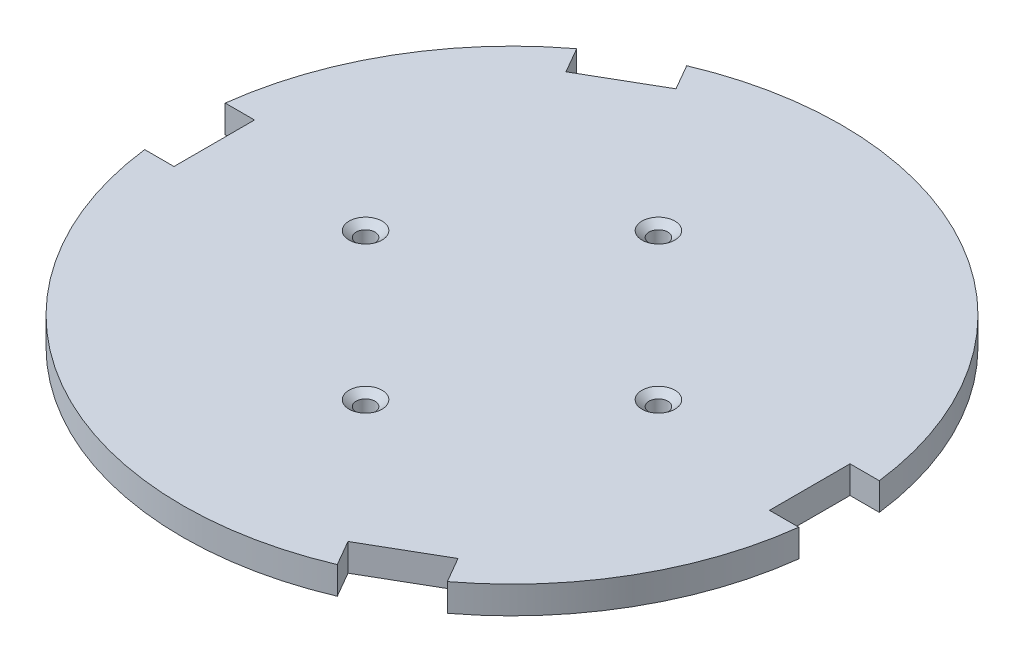
ISO-10303-21;
HEADER;
FILE_DESCRIPTION(('STEP AP214'),'2;1');
FILE_NAME('part.step','',(''),(''),'','','');
FILE_SCHEMA(('AUTOMOTIVE_DESIGN { 1 0 10303 214 1 1 1 1 }'));
ENDSEC;
DATA;
#1=APPLICATION_CONTEXT('core data for automotive mechanical design processes');
#2=APPLICATION_PROTOCOL_DEFINITION('international standard','automotive_design',2000,#1);
#3=PRODUCT_CONTEXT('',#1,'mechanical');
#4=PRODUCT('Part','Part','',(#3));
#5=PRODUCT_RELATED_PRODUCT_CATEGORY('part','',(#4));
#6=PRODUCT_DEFINITION_FORMATION('','',#4);
#7=PRODUCT_DEFINITION_CONTEXT('part definition',#1,'design');
#8=PRODUCT_DEFINITION('design','',#6,#7);
#9=PRODUCT_DEFINITION_SHAPE('','',#8);
#10=(LENGTH_UNIT() NAMED_UNIT(*) SI_UNIT(.MILLI.,.METRE.));
#11=(NAMED_UNIT(*) PLANE_ANGLE_UNIT() SI_UNIT($,.RADIAN.));
#12=(NAMED_UNIT(*) SI_UNIT($,.STERADIAN.) SOLID_ANGLE_UNIT());
#13=UNCERTAINTY_MEASURE_WITH_UNIT(LENGTH_MEASURE(1.E-05),#10,'distance_accuracy_value','');
#14=(GEOMETRIC_REPRESENTATION_CONTEXT(3) GLOBAL_UNCERTAINTY_ASSIGNED_CONTEXT((#13)) GLOBAL_UNIT_ASSIGNED_CONTEXT((#10,
#11,#12)) REPRESENTATION_CONTEXT('',''));
#15=CARTESIAN_POINT('',(0.,0.,0.));
#16=DIRECTION('',(0.,0.,1.));
#17=DIRECTION('',(1.,0.,0.));
#18=AXIS2_PLACEMENT_3D('',#15,#16,#17);
#19=CARTESIAN_POINT('',(0.,4.7625,0.));
#20=DIRECTION('',(0.,-1.,0.));
#21=DIRECTION('',(0.,0.,-1.));
#22=AXIS2_PLACEMENT_3D('',#19,#20,#21);
#23=CYLINDRICAL_SURFACE('',#22,57.15);
#24=CARTESIAN_POINT('',(0.,0.,0.));
#25=DIRECTION('',(0.,1.,0.));
#26=DIRECTION('',(0.,0.,1.));
#27=AXIS2_PLACEMENT_3D('',#24,#25,#26);
#28=CIRCLE('',#27,57.15);
#29=CARTESIAN_POINT('',(56.7215327278804,0.,-6.985));
#30=VERTEX_POINT('',#29);
#31=CARTESIAN_POINT('',(-22.3115789185058,0.,-52.6147882839349));
#32=VERTEX_POINT('',#31);
#33=EDGE_CURVE('E181',#30,#32,#28,.T.);
#34=ORIENTED_EDGE('',*,*,#33,.T.);
#35=DIRECTION('',(0.,1.,0.));
#36=VECTOR('',#35,1.);
#37=CARTESIAN_POINT('',(-22.3115789185058,-0.00100000000000013,-52.6147882839349));
#38=LINE('',#37,#36);
#39=CARTESIAN_POINT('',(-22.3115789185058,4.7625,-52.6147882839349));
#40=VERTEX_POINT('',#39);
#41=EDGE_CURVE('E293',#32,#40,#38,.T.);
#42=ORIENTED_EDGE('',*,*,#41,.T.);
#43=CARTESIAN_POINT('',(0.,4.7625,0.));
#44=DIRECTION('',(0.,1.,0.));
#45=DIRECTION('',(0.,0.,1.));
#46=AXIS2_PLACEMENT_3D('',#43,#44,#45);
#47=CIRCLE('',#46,57.15);
#48=CARTESIAN_POINT('',(56.7215327278804,4.7625,-6.985));
#49=VERTEX_POINT('',#48);
#50=EDGE_CURVE('E11',#49,#40,#47,.T.);
#51=ORIENTED_EDGE('',*,*,#50,.F.);
#52=DIRECTION('',(0.,1.,0.));
#53=VECTOR('',#52,1.);
#54=CARTESIAN_POINT('',(56.7215327278804,-0.00100000000000013,-6.985));
#55=LINE('',#54,#53);
#56=EDGE_CURVE('E260',#30,#49,#55,.T.);
#57=ORIENTED_EDGE('',*,*,#56,.F.);
#58=EDGE_LOOP('',(#34,#42,#51,#57));
#59=FACE_BOUND('',#58,.T.);
#60=ADVANCED_FACE('F38',(#59),#23,.T.);
#61=CARTESIAN_POINT('',(-56.7215327278803,0.,6.98500000000001));
#62=VERTEX_POINT('',#61);
#63=CARTESIAN_POINT('',(22.3115789185057,0.,52.6147882839349));
#64=VERTEX_POINT('',#63);
#65=EDGE_CURVE('E42',#62,#64,#28,.T.);
#66=ORIENTED_EDGE('',*,*,#65,.T.);
#67=DIRECTION('',(0.,1.,0.));
#68=VECTOR('',#67,1.);
#69=CARTESIAN_POINT('',(22.3115789185057,-0.00100000000000013,52.6147882839349));
#70=LINE('',#69,#68);
#71=CARTESIAN_POINT('',(22.3115789185057,4.7625,52.6147882839349));
#72=VERTEX_POINT('',#71);
#73=EDGE_CURVE('E154',#64,#72,#70,.T.);
#74=ORIENTED_EDGE('',*,*,#73,.T.);
#75=CARTESIAN_POINT('',(-56.7215327278804,4.7625,6.98500000000001));
#76=VERTEX_POINT('',#75);
#77=EDGE_CURVE('E49',#76,#72,#47,.T.);
#78=ORIENTED_EDGE('',*,*,#77,.F.);
#79=DIRECTION('',(0.,1.,0.));
#80=VECTOR('',#79,1.);
#81=CARTESIAN_POINT('',(-56.7215327278804,-0.00100000000000013,6.98500000000001));
#82=LINE('',#81,#80);
#83=EDGE_CURVE('E177',#62,#76,#82,.T.);
#84=ORIENTED_EDGE('',*,*,#83,.F.);
#85=EDGE_LOOP('',(#66,#74,#78,#84));
#86=FACE_BOUND('',#85,.T.);
#87=ADVANCED_FACE('F176',(#86),#23,.T.);
#88=CARTESIAN_POINT('',(-34.4099538093744,4.7625,-45.6297882839349));
#89=VERTEX_POINT('',#88);
#90=CARTESIAN_POINT('',(-56.7215327278804,4.7625,-6.98499999999999));
#91=VERTEX_POINT('',#90);
#92=EDGE_CURVE('E48',#89,#91,#47,.T.);
#93=ORIENTED_EDGE('',*,*,#92,.F.);
#94=DIRECTION('',(0.,1.,0.));
#95=VECTOR('',#94,1.);
#96=CARTESIAN_POINT('',(-34.4099538093744,-0.00100000000000013,-45.6297882839349));
#97=LINE('',#96,#95);
#98=CARTESIAN_POINT('',(-34.4099538093744,0.,-45.6297882839349));
#99=VERTEX_POINT('',#98);
#100=EDGE_CURVE('E294',#99,#89,#97,.T.);
#101=ORIENTED_EDGE('',*,*,#100,.F.);
#102=CARTESIAN_POINT('',(-56.7215327278804,0.,-6.98499999999999));
#103=VERTEX_POINT('',#102);
#104=EDGE_CURVE('E179',#99,#103,#28,.T.);
#105=ORIENTED_EDGE('',*,*,#104,.T.);
#106=DIRECTION('',(0.,1.,0.));
#107=VECTOR('',#106,1.);
#108=CARTESIAN_POINT('',(-56.7215327278804,-0.00100000000000013,-6.98499999999999));
#109=LINE('',#108,#107);
#110=EDGE_CURVE('E218',#103,#91,#109,.T.);
#111=ORIENTED_EDGE('',*,*,#110,.T.);
#112=EDGE_LOOP('',(#93,#101,#105,#111));
#113=FACE_BOUND('',#112,.T.);
#114=ADVANCED_FACE('F225',(#113),#23,.T.);
#115=CARTESIAN_POINT('',(34.4099538093744,4.7625,45.6297882839349));
#116=VERTEX_POINT('',#115);
#117=CARTESIAN_POINT('',(56.7215327278804,4.7625,6.985));
#118=VERTEX_POINT('',#117);
#119=EDGE_CURVE('E187',#116,#118,#47,.T.);
#120=ORIENTED_EDGE('',*,*,#119,.F.);
#121=DIRECTION('',(0.,1.,0.));
#122=VECTOR('',#121,1.);
#123=CARTESIAN_POINT('',(34.4099538093744,-0.00100000000000013,45.6297882839349));
#124=LINE('',#123,#122);
#125=CARTESIAN_POINT('',(34.4099538093744,0.,45.6297882839349));
#126=VERTEX_POINT('',#125);
#127=EDGE_CURVE('E165',#126,#116,#124,.T.);
#128=ORIENTED_EDGE('',*,*,#127,.F.);
#129=CARTESIAN_POINT('',(56.7215327278804,0.,6.985));
#130=VERTEX_POINT('',#129);
#131=EDGE_CURVE('E180',#126,#130,#28,.T.);
#132=ORIENTED_EDGE('',*,*,#131,.T.);
#133=DIRECTION('',(0.,1.,0.));
#134=VECTOR('',#133,1.);
#135=CARTESIAN_POINT('',(56.7215327278804,-0.00100000000000013,6.985));
#136=LINE('',#135,#134);
#137=EDGE_CURVE('E268',#130,#118,#136,.T.);
#138=ORIENTED_EDGE('',*,*,#137,.T.);
#139=EDGE_LOOP('',(#120,#128,#132,#138));
#140=FACE_BOUND('',#139,.T.);
#141=ADVANCED_FACE('F40',(#140),#23,.T.);
#142=CARTESIAN_POINT('',(0.,4.7625,0.));
#143=DIRECTION('',(0.,1.,0.));
#144=DIRECTION('',(0.,0.,1.));
#145=AXIS2_PLACEMENT_3D('',#142,#143,#144);
#146=PLANE('',#145);
#147=CARTESIAN_POINT('',(25.4,4.7625,0.));
#148=DIRECTION('',(0.,1.,0.));
#149=DIRECTION('',(0.,0.,1.));
#150=AXIS2_PLACEMENT_3D('',#147,#148,#149);
#151=CIRCLE('',#150,2.8575);
#152=CARTESIAN_POINT('',(25.4,4.7625,2.85749999999991));
#153=VERTEX_POINT('',#152);
#154=EDGE_CURVE('E384',#153,#153,#151,.T.);
#155=ORIENTED_EDGE('',*,*,#154,.F.);
#156=EDGE_LOOP('',(#155));
#157=FACE_BOUND('',#156,.T.);
#158=CARTESIAN_POINT('',(1.00613961606655E-13,4.7625,25.4));
#159=DIRECTION('',(0.,1.,0.));
#160=DIRECTION('',(0.,0.,1.));
#161=AXIS2_PLACEMENT_3D('',#158,#159,#160);
#162=CIRCLE('',#161,2.8575);
#163=CARTESIAN_POINT('',(1.00613961606655E-13,4.7625,28.2575));
#164=VERTEX_POINT('',#163);
#165=EDGE_CURVE('E372',#164,#164,#162,.T.);
#166=ORIENTED_EDGE('',*,*,#165,.F.);
#167=EDGE_LOOP('',(#166));
#168=FACE_BOUND('',#167,.T.);
#169=CARTESIAN_POINT('',(-1.00613961606655E-13,4.7625,-25.4));
#170=DIRECTION('',(0.,1.,0.));
#171=DIRECTION('',(0.,0.,1.));
#172=AXIS2_PLACEMENT_3D('',#169,#170,#171);
#173=CIRCLE('',#172,2.8575);
#174=CARTESIAN_POINT('',(-1.00613961606655E-13,4.7625,-22.5425));
#175=VERTEX_POINT('',#174);
#176=EDGE_CURVE('E360',#175,#175,#173,.T.);
#177=ORIENTED_EDGE('',*,*,#176,.F.);
#178=EDGE_LOOP('',(#177));
#179=FACE_BOUND('',#178,.T.);
#180=CARTESIAN_POINT('',(-25.4,4.7625,1.00613961606655E-13));
#181=DIRECTION('',(0.,1.,0.));
#182=DIRECTION('',(0.,0.,1.));
#183=AXIS2_PLACEMENT_3D('',#180,#181,#182);
#184=CIRCLE('',#183,2.8575);
#185=CARTESIAN_POINT('',(-25.4,4.7625,2.8575000000001));
#186=VERTEX_POINT('',#185);
#187=EDGE_CURVE('E348',#186,#186,#184,.T.);
#188=ORIENTED_EDGE('',*,*,#187,.F.);
#189=EDGE_LOOP('',(#188));
#190=FACE_BOUND('',#189,.T.);
#191=DIRECTION('',(0.499999999999998,0.,0.86602540378444));
#192=VECTOR('',#191,1.);
#193=CARTESIAN_POINT('',(19.7715789185057,4.7625,48.2153792327099));
#194=LINE('',#193,#192);
#195=CARTESIAN_POINT('',(19.7715789185057,4.7625,48.2153792327099));
#196=VERTEX_POINT('',#195);
#197=EDGE_CURVE('E159',#196,#72,#194,.T.);
#198=ORIENTED_EDGE('',*,*,#197,.F.);
#199=DIRECTION('',(-0.866025403784441,0.,0.499999999999996));
#200=VECTOR('',#199,1.);
#201=CARTESIAN_POINT('',(19.7715789185057,4.7625,48.2153792327099));
#202=LINE('',#201,#200);
#203=CARTESIAN_POINT('',(31.8699538093744,4.7625,41.2303792327099));
#204=VERTEX_POINT('',#203);
#205=EDGE_CURVE('E166',#204,#196,#202,.T.);
#206=ORIENTED_EDGE('',*,*,#205,.F.);
#207=DIRECTION('',(-0.499999999999997,0.,-0.86602540378444));
#208=VECTOR('',#207,1.);
#209=CARTESIAN_POINT('',(31.8699538093744,4.7625,41.2303792327099));
#210=LINE('',#209,#208);
#211=EDGE_CURVE('E331',#116,#204,#210,.T.);
#212=ORIENTED_EDGE('',*,*,#211,.F.);
#213=ORIENTED_EDGE('',*,*,#119,.T.);
#214=DIRECTION('',(1.,0.,0.));
#215=VECTOR('',#214,1.);
#216=CARTESIAN_POINT('',(51.6415327278804,4.7625,6.985));
#217=LINE('',#216,#215);
#218=CARTESIAN_POINT('',(51.6415327278804,4.7625,6.985));
#219=VERTEX_POINT('',#218);
#220=EDGE_CURVE('E265',#219,#118,#217,.T.);
#221=ORIENTED_EDGE('',*,*,#220,.F.);
#222=DIRECTION('',(0.,0.,1.));
#223=VECTOR('',#222,1.);
#224=CARTESIAN_POINT('',(51.6415327278804,4.7625,-6.985));
#225=LINE('',#224,#223);
#226=CARTESIAN_POINT('',(51.6415327278804,4.7625,-6.985));
#227=VERTEX_POINT('',#226);
#228=EDGE_CURVE('E276',#227,#219,#225,.T.);
#229=ORIENTED_EDGE('',*,*,#228,.F.);
#230=DIRECTION('',(-1.,0.,0.));
#231=VECTOR('',#230,1.);
#232=CARTESIAN_POINT('',(51.6415327278804,4.7625,-6.985));
#233=LINE('',#232,#231);
#234=EDGE_CURVE('E280',#49,#227,#233,.T.);
#235=ORIENTED_EDGE('',*,*,#234,.F.);
#236=ORIENTED_EDGE('',*,*,#50,.T.);
#237=DIRECTION('',(-0.499999999999999,0.,-0.86602540378444));
#238=VECTOR('',#237,1.);
#239=CARTESIAN_POINT('',(-19.7715789185058,4.7625,-48.2153792327099));
#240=LINE('',#239,#238);
#241=CARTESIAN_POINT('',(-19.7715789185058,4.7625,-48.2153792327099));
#242=VERTEX_POINT('',#241);
#243=EDGE_CURVE('E298',#242,#40,#240,.T.);
#244=ORIENTED_EDGE('',*,*,#243,.F.);
#245=DIRECTION('',(0.866025403784438,0.,-0.500000000000001));
#246=VECTOR('',#245,1.);
#247=CARTESIAN_POINT('',(-31.8699538093744,4.7625,-41.2303792327099));
#248=LINE('',#247,#246);
#249=CARTESIAN_POINT('',(-31.8699538093744,4.7625,-41.2303792327099));
#250=VERTEX_POINT('',#249);
#251=EDGE_CURVE('E308',#250,#242,#248,.T.);
#252=ORIENTED_EDGE('',*,*,#251,.F.);
#253=DIRECTION('',(0.5,0.,0.866025403784439));
#254=VECTOR('',#253,1.);
#255=CARTESIAN_POINT('',(-31.8699538093744,4.7625,-41.2303792327099));
#256=LINE('',#255,#254);
#257=EDGE_CURVE('E210',#89,#250,#256,.T.);
#258=ORIENTED_EDGE('',*,*,#257,.F.);
#259=ORIENTED_EDGE('',*,*,#92,.T.);
#260=DIRECTION('',(-1.,0.,0.));
#261=VECTOR('',#260,1.);
#262=CARTESIAN_POINT('',(-51.6415327278804,4.7625,-6.98499999999999));
#263=LINE('',#262,#261);
#264=CARTESIAN_POINT('',(-51.6415327278804,4.7625,-6.98499999999999));
#265=VERTEX_POINT('',#264);
#266=EDGE_CURVE('E207',#265,#91,#263,.T.);
#267=ORIENTED_EDGE('',*,*,#266,.F.);
#268=DIRECTION('',(0.,0.,-1.));
#269=VECTOR('',#268,1.);
#270=CARTESIAN_POINT('',(-51.6415327278804,4.7625,-6.98499999999999));
#271=LINE('',#270,#269);
#272=CARTESIAN_POINT('',(-51.6415327278804,4.7625,6.98500000000001));
#273=VERTEX_POINT('',#272);
#274=EDGE_CURVE('E223',#273,#265,#271,.T.);
#275=ORIENTED_EDGE('',*,*,#274,.F.);
#276=DIRECTION('',(1.,0.,0.));
#277=VECTOR('',#276,1.);
#278=CARTESIAN_POINT('',(-51.6415327278804,4.7625,6.98500000000001));
#279=LINE('',#278,#277);
#280=EDGE_CURVE('E245',#76,#273,#279,.T.);
#281=ORIENTED_EDGE('',*,*,#280,.F.);
#282=ORIENTED_EDGE('',*,*,#77,.T.);
#283=EDGE_LOOP('',(#198,#206,#212,#213,#221,#229,#235,#236,#244,#252,#258,#259,#267,#275,#281,#282));
#284=FACE_BOUND('',#283,.T.);
#285=ADVANCED_FACE('F205',(#157,#168,#179,#190,#284),#146,.T.);
#286=CARTESIAN_POINT('',(0.,0.,0.));
#287=DIRECTION('',(0.,1.,0.));
#288=DIRECTION('',(0.,0.,1.));
#289=AXIS2_PLACEMENT_3D('',#286,#287,#288);
#290=PLANE('',#289);
#291=CARTESIAN_POINT('',(25.4,0.,0.));
#292=DIRECTION('',(0.,1.,0.));
#293=DIRECTION('',(0.,0.,1.));
#294=AXIS2_PLACEMENT_3D('',#291,#292,#293);
#295=CIRCLE('',#294,1.63195);
#296=CARTESIAN_POINT('',(25.4,0.,1.63194999999991));
#297=VERTEX_POINT('',#296);
#298=EDGE_CURVE('E376',#297,#297,#295,.T.);
#299=ORIENTED_EDGE('',*,*,#298,.T.);
#300=EDGE_LOOP('',(#299));
#301=FACE_BOUND('',#300,.T.);
#302=CARTESIAN_POINT('',(1.00613961606655E-13,0.,25.4));
#303=DIRECTION('',(0.,1.,0.));
#304=DIRECTION('',(0.,0.,1.));
#305=AXIS2_PLACEMENT_3D('',#302,#303,#304);
#306=CIRCLE('',#305,1.63195);
#307=CARTESIAN_POINT('',(1.00613961606655E-13,0.,27.03195));
#308=VERTEX_POINT('',#307);
#309=EDGE_CURVE('E364',#308,#308,#306,.T.);
#310=ORIENTED_EDGE('',*,*,#309,.T.);
#311=EDGE_LOOP('',(#310));
#312=FACE_BOUND('',#311,.T.);
#313=CARTESIAN_POINT('',(-1.00613961606655E-13,0.,-25.4));
#314=DIRECTION('',(0.,1.,0.));
#315=DIRECTION('',(0.,0.,1.));
#316=AXIS2_PLACEMENT_3D('',#313,#314,#315);
#317=CIRCLE('',#316,1.63195);
#318=CARTESIAN_POINT('',(-1.00613961606655E-13,0.,-23.76805));
#319=VERTEX_POINT('',#318);
#320=EDGE_CURVE('E352',#319,#319,#317,.T.);
#321=ORIENTED_EDGE('',*,*,#320,.T.);
#322=EDGE_LOOP('',(#321));
#323=FACE_BOUND('',#322,.T.);
#324=CARTESIAN_POINT('',(-25.4,0.,1.00613961606655E-13));
#325=DIRECTION('',(0.,1.,0.));
#326=DIRECTION('',(0.,0.,1.));
#327=AXIS2_PLACEMENT_3D('',#324,#325,#326);
#328=CIRCLE('',#327,1.63195);
#329=CARTESIAN_POINT('',(-25.4,0.,1.6319500000001));
#330=VERTEX_POINT('',#329);
#331=EDGE_CURVE('E319',#330,#330,#328,.T.);
#332=ORIENTED_EDGE('',*,*,#331,.T.);
#333=EDGE_LOOP('',(#332));
#334=FACE_BOUND('',#333,.T.);
#335=DIRECTION('',(0.866025403784441,0.,-0.499999999999996));
#336=VECTOR('',#335,1.);
#337=CARTESIAN_POINT('',(19.7715789185057,0.,48.2153792327099));
#338=LINE('',#337,#336);
#339=CARTESIAN_POINT('',(19.7715789185057,0.,48.2153792327099));
#340=VERTEX_POINT('',#339);
#341=CARTESIAN_POINT('',(31.8699538093744,0.,41.2303792327099));
#342=VERTEX_POINT('',#341);
#343=EDGE_CURVE('E56',#340,#342,#338,.T.);
#344=ORIENTED_EDGE('',*,*,#343,.F.);
#345=DIRECTION('',(-0.499999999999998,0.,-0.86602540378444));
#346=VECTOR('',#345,1.);
#347=CARTESIAN_POINT('',(19.7715789185057,0.,48.2153792327099));
#348=LINE('',#347,#346);
#349=EDGE_CURVE('E157',#64,#340,#348,.T.);
#350=ORIENTED_EDGE('',*,*,#349,.F.);
#351=ORIENTED_EDGE('',*,*,#65,.F.);
#352=DIRECTION('',(-1.,0.,0.));
#353=VECTOR('',#352,1.);
#354=CARTESIAN_POINT('',(-51.6415327278804,0.,6.98500000000001));
#355=LINE('',#354,#353);
#356=CARTESIAN_POINT('',(-51.6415327278804,0.,6.98500000000001));
#357=VERTEX_POINT('',#356);
#358=EDGE_CURVE('E228',#357,#62,#355,.T.);
#359=ORIENTED_EDGE('',*,*,#358,.F.);
#360=DIRECTION('',(0.,0.,1.));
#361=VECTOR('',#360,1.);
#362=CARTESIAN_POINT('',(-51.6415327278804,0.,-6.98499999999999));
#363=LINE('',#362,#361);
#364=CARTESIAN_POINT('',(-51.6415327278804,0.,-6.98499999999999));
#365=VERTEX_POINT('',#364);
#366=EDGE_CURVE('E251',#365,#357,#363,.T.);
#367=ORIENTED_EDGE('',*,*,#366,.F.);
#368=DIRECTION('',(1.,0.,0.));
#369=VECTOR('',#368,1.);
#370=CARTESIAN_POINT('',(-51.6415327278804,0.,-6.98499999999999));
#371=LINE('',#370,#369);
#372=EDGE_CURVE('E247',#103,#365,#371,.T.);
#373=ORIENTED_EDGE('',*,*,#372,.F.);
#374=ORIENTED_EDGE('',*,*,#104,.F.);
#375=DIRECTION('',(-0.5,0.,-0.866025403784439));
#376=VECTOR('',#375,1.);
#377=CARTESIAN_POINT('',(-31.8699538093744,0.,-41.2303792327099));
#378=LINE('',#377,#376);
#379=CARTESIAN_POINT('',(-31.8699538093744,0.,-41.2303792327099));
#380=VERTEX_POINT('',#379);
#381=EDGE_CURVE('E289',#380,#99,#378,.T.);
#382=ORIENTED_EDGE('',*,*,#381,.F.);
#383=DIRECTION('',(-0.866025403784438,0.,0.500000000000001));
#384=VECTOR('',#383,1.);
#385=CARTESIAN_POINT('',(-31.8699538093744,0.,-41.2303792327099));
#386=LINE('',#385,#384);
#387=CARTESIAN_POINT('',(-19.7715789185058,0.,-48.2153792327099));
#388=VERTEX_POINT('',#387);
#389=EDGE_CURVE('E64',#388,#380,#386,.T.);
#390=ORIENTED_EDGE('',*,*,#389,.F.);
#391=DIRECTION('',(0.499999999999999,0.,0.86602540378444));
#392=VECTOR('',#391,1.);
#393=CARTESIAN_POINT('',(-19.7715789185058,0.,-48.2153792327099));
#394=LINE('',#393,#392);
#395=EDGE_CURVE('E314',#32,#388,#394,.T.);
#396=ORIENTED_EDGE('',*,*,#395,.F.);
#397=ORIENTED_EDGE('',*,*,#33,.F.);
#398=DIRECTION('',(1.,0.,0.));
#399=VECTOR('',#398,1.);
#400=CARTESIAN_POINT('',(51.6415327278804,0.,-6.985));
#401=LINE('',#400,#399);
#402=CARTESIAN_POINT('',(51.6415327278804,0.,-6.985));
#403=VERTEX_POINT('',#402);
#404=EDGE_CURVE('E284',#403,#30,#401,.T.);
#405=ORIENTED_EDGE('',*,*,#404,.F.);
#406=DIRECTION('',(0.,0.,-1.));
#407=VECTOR('',#406,1.);
#408=CARTESIAN_POINT('',(51.6415327278804,0.,-6.985));
#409=LINE('',#408,#407);
#410=CARTESIAN_POINT('',(51.6415327278804,0.,6.985));
#411=VERTEX_POINT('',#410);
#412=EDGE_CURVE('E184',#411,#403,#409,.T.);
#413=ORIENTED_EDGE('',*,*,#412,.F.);
#414=DIRECTION('',(-1.,0.,0.));
#415=VECTOR('',#414,1.);
#416=CARTESIAN_POINT('',(51.6415327278804,0.,6.985));
#417=LINE('',#416,#415);
#418=EDGE_CURVE('E232',#130,#411,#417,.T.);
#419=ORIENTED_EDGE('',*,*,#418,.F.);
#420=ORIENTED_EDGE('',*,*,#131,.F.);
#421=DIRECTION('',(0.499999999999998,0.,0.86602540378444));
#422=VECTOR('',#421,1.);
#423=CARTESIAN_POINT('',(31.8699538093744,0.,41.2303792327099));
#424=LINE('',#423,#422);
#425=EDGE_CURVE('E292',#342,#126,#424,.T.);
#426=ORIENTED_EDGE('',*,*,#425,.F.);
#427=EDGE_LOOP('',(#344,#350,#351,#359,#367,#373,#374,#382,#390,#396,#397,#405,#413,#419,#420,#426));
#428=FACE_BOUND('',#427,.T.);
#429=ADVANCED_FACE('F170',(#301,#312,#323,#334,#428),#290,.F.);
#430=CARTESIAN_POINT('',(-51.6415327278804,-0.00100000000000013,-6.98499999999999));
#431=DIRECTION('',(0.,0.,-1.));
#432=DIRECTION('',(-1.,0.,0.));
#433=AXIS2_PLACEMENT_3D('',#430,#431,#432);
#434=PLANE('',#433);
#435=ORIENTED_EDGE('',*,*,#372,.T.);
#436=DIRECTION('',(0.,1.,0.));
#437=VECTOR('',#436,1.);
#438=CARTESIAN_POINT('',(-51.6415327278804,-0.00100000000000013,-6.98499999999999));
#439=LINE('',#438,#437);
#440=EDGE_CURVE('E220',#365,#265,#439,.T.);
#441=ORIENTED_EDGE('',*,*,#440,.T.);
#442=ORIENTED_EDGE('',*,*,#266,.T.);
#443=ORIENTED_EDGE('',*,*,#110,.F.);
#444=EDGE_LOOP('',(#435,#441,#442,#443));
#445=FACE_BOUND('',#444,.T.);
#446=ADVANCED_FACE('F217',(#445),#434,.F.);
#447=CARTESIAN_POINT('',(-51.6415327278804,-0.00100000000000013,-6.98499999999999));
#448=DIRECTION('',(1.,0.,0.));
#449=DIRECTION('',(0.,0.,-1.));
#450=AXIS2_PLACEMENT_3D('',#447,#448,#449);
#451=PLANE('',#450);
#452=ORIENTED_EDGE('',*,*,#366,.T.);
#453=DIRECTION('',(0.,1.,0.));
#454=VECTOR('',#453,1.);
#455=CARTESIAN_POINT('',(-51.6415327278804,-0.00100000000000013,6.98500000000001));
#456=LINE('',#455,#454);
#457=EDGE_CURVE('E233',#357,#273,#456,.T.);
#458=ORIENTED_EDGE('',*,*,#457,.T.);
#459=ORIENTED_EDGE('',*,*,#274,.T.);
#460=ORIENTED_EDGE('',*,*,#440,.F.);
#461=EDGE_LOOP('',(#452,#458,#459,#460));
#462=FACE_BOUND('',#461,.T.);
#463=ADVANCED_FACE('F469',(#462),#451,.F.);
#464=CARTESIAN_POINT('',(-51.6415327278804,-0.00100000000000013,6.98500000000001));
#465=DIRECTION('',(0.,0.,1.));
#466=DIRECTION('',(1.,0.,0.));
#467=AXIS2_PLACEMENT_3D('',#464,#465,#466);
#468=PLANE('',#467);
#469=ORIENTED_EDGE('',*,*,#358,.T.);
#470=ORIENTED_EDGE('',*,*,#83,.T.);
#471=ORIENTED_EDGE('',*,*,#280,.T.);
#472=ORIENTED_EDGE('',*,*,#457,.F.);
#473=EDGE_LOOP('',(#469,#470,#471,#472));
#474=FACE_BOUND('',#473,.T.);
#475=ADVANCED_FACE('F243',(#474),#468,.F.);
#476=CARTESIAN_POINT('',(51.6415327278804,-0.00100000000000013,-6.985));
#477=DIRECTION('',(0.,0.,-1.));
#478=DIRECTION('',(-1.,0.,0.));
#479=AXIS2_PLACEMENT_3D('',#476,#477,#478);
#480=PLANE('',#479);
#481=ORIENTED_EDGE('',*,*,#404,.T.);
#482=ORIENTED_EDGE('',*,*,#56,.T.);
#483=ORIENTED_EDGE('',*,*,#234,.T.);
#484=DIRECTION('',(0.,1.,0.));
#485=VECTOR('',#484,1.);
#486=CARTESIAN_POINT('',(51.6415327278804,-0.00100000000000013,-6.985));
#487=LINE('',#486,#485);
#488=EDGE_CURVE('E261',#403,#227,#487,.T.);
#489=ORIENTED_EDGE('',*,*,#488,.F.);
#490=EDGE_LOOP('',(#481,#482,#483,#489));
#491=FACE_BOUND('',#490,.T.);
#492=ADVANCED_FACE('F462',(#491),#480,.F.);
#493=CARTESIAN_POINT('',(51.6415327278804,-0.00100000000000013,6.985));
#494=DIRECTION('',(0.,0.,1.));
#495=DIRECTION('',(1.,0.,0.));
#496=AXIS2_PLACEMENT_3D('',#493,#494,#495);
#497=PLANE('',#496);
#498=ORIENTED_EDGE('',*,*,#418,.T.);
#499=DIRECTION('',(0.,1.,0.));
#500=VECTOR('',#499,1.);
#501=CARTESIAN_POINT('',(51.6415327278804,-0.00100000000000013,6.985));
#502=LINE('',#501,#500);
#503=EDGE_CURVE('E264',#411,#219,#502,.T.);
#504=ORIENTED_EDGE('',*,*,#503,.T.);
#505=ORIENTED_EDGE('',*,*,#220,.T.);
#506=ORIENTED_EDGE('',*,*,#137,.F.);
#507=EDGE_LOOP('',(#498,#504,#505,#506));
#508=FACE_BOUND('',#507,.T.);
#509=ADVANCED_FACE('F432',(#508),#497,.F.);
#510=CARTESIAN_POINT('',(51.6415327278804,-0.00100000000000013,-6.985));
#511=DIRECTION('',(-1.,0.,0.));
#512=DIRECTION('',(0.,0.,1.));
#513=AXIS2_PLACEMENT_3D('',#510,#511,#512);
#514=PLANE('',#513);
#515=ORIENTED_EDGE('',*,*,#412,.T.);
#516=ORIENTED_EDGE('',*,*,#488,.T.);
#517=ORIENTED_EDGE('',*,*,#228,.T.);
#518=ORIENTED_EDGE('',*,*,#503,.F.);
#519=EDGE_LOOP('',(#515,#516,#517,#518));
#520=FACE_BOUND('',#519,.T.);
#521=ADVANCED_FACE('F437',(#520),#514,.F.);
#522=CARTESIAN_POINT('',(-19.7715789185058,-0.00100000000000013,-48.2153792327099));
#523=DIRECTION('',(0.86602540378444,0.,-0.499999999999999));
#524=DIRECTION('',(-0.499999999999999,0.,-0.86602540378444));
#525=AXIS2_PLACEMENT_3D('',#522,#523,#524);
#526=PLANE('',#525);
#527=ORIENTED_EDGE('',*,*,#395,.T.);
#528=DIRECTION('',(0.,1.,0.));
#529=VECTOR('',#528,1.);
#530=CARTESIAN_POINT('',(-19.7715789185058,-0.00100000000000013,-48.2153792327099));
#531=LINE('',#530,#529);
#532=EDGE_CURVE('E301',#388,#242,#531,.T.);
#533=ORIENTED_EDGE('',*,*,#532,.T.);
#534=ORIENTED_EDGE('',*,*,#243,.T.);
#535=ORIENTED_EDGE('',*,*,#41,.F.);
#536=EDGE_LOOP('',(#527,#533,#534,#535));
#537=FACE_BOUND('',#536,.T.);
#538=ADVANCED_FACE('F445',(#537),#526,.F.);
#539=CARTESIAN_POINT('',(-31.8699538093744,-0.00100000000000013,-41.2303792327099));
#540=DIRECTION('',(0.500000000000001,0.,0.866025403784438));
#541=DIRECTION('',(0.866025403784438,0.,-0.500000000000001));
#542=AXIS2_PLACEMENT_3D('',#539,#540,#541);
#543=PLANE('',#542);
#544=ORIENTED_EDGE('',*,*,#389,.T.);
#545=DIRECTION('',(0.,1.,0.));
#546=VECTOR('',#545,1.);
#547=CARTESIAN_POINT('',(-31.8699538093744,-0.00100000000000013,-41.2303792327099));
#548=LINE('',#547,#546);
#549=EDGE_CURVE('E297',#380,#250,#548,.T.);
#550=ORIENTED_EDGE('',*,*,#549,.T.);
#551=ORIENTED_EDGE('',*,*,#251,.T.);
#552=ORIENTED_EDGE('',*,*,#532,.F.);
#553=EDGE_LOOP('',(#544,#550,#551,#552));
#554=FACE_BOUND('',#553,.T.);
#555=ADVANCED_FACE('F449',(#554),#543,.F.);
#556=CARTESIAN_POINT('',(-31.8699538093744,-0.00100000000000013,-41.2303792327099));
#557=DIRECTION('',(-0.866025403784439,0.,0.5));
#558=DIRECTION('',(0.5,0.,0.866025403784439));
#559=AXIS2_PLACEMENT_3D('',#556,#557,#558);
#560=PLANE('',#559);
#561=ORIENTED_EDGE('',*,*,#381,.T.);
#562=ORIENTED_EDGE('',*,*,#100,.T.);
#563=ORIENTED_EDGE('',*,*,#257,.T.);
#564=ORIENTED_EDGE('',*,*,#549,.F.);
#565=EDGE_LOOP('',(#561,#562,#563,#564));
#566=FACE_BOUND('',#565,.T.);
#567=ADVANCED_FACE('F448',(#566),#560,.F.);
#568=CARTESIAN_POINT('',(19.7715789185057,-0.00100000000000013,48.2153792327099));
#569=DIRECTION('',(-0.86602540378444,0.,0.499999999999998));
#570=DIRECTION('',(0.499999999999998,0.,0.86602540378444));
#571=AXIS2_PLACEMENT_3D('',#568,#569,#570);
#572=PLANE('',#571);
#573=ORIENTED_EDGE('',*,*,#349,.T.);
#574=DIRECTION('',(0.,1.,0.));
#575=VECTOR('',#574,1.);
#576=CARTESIAN_POINT('',(19.7715789185057,-0.00100000000000013,48.2153792327099));
#577=LINE('',#576,#575);
#578=EDGE_CURVE('E256',#340,#196,#577,.T.);
#579=ORIENTED_EDGE('',*,*,#578,.T.);
#580=ORIENTED_EDGE('',*,*,#197,.T.);
#581=ORIENTED_EDGE('',*,*,#73,.F.);
#582=EDGE_LOOP('',(#573,#579,#580,#581));
#583=FACE_BOUND('',#582,.T.);
#584=ADVANCED_FACE('F156',(#583),#572,.F.);
#585=CARTESIAN_POINT('',(19.7715789185057,-0.00100000000000013,48.2153792327099));
#586=DIRECTION('',(-0.499999999999996,0.,-0.866025403784441));
#587=DIRECTION('',(-0.866025403784441,0.,0.499999999999996));
#588=AXIS2_PLACEMENT_3D('',#585,#586,#587);
#589=PLANE('',#588);
#590=ORIENTED_EDGE('',*,*,#343,.T.);
#591=DIRECTION('',(0.,1.,0.));
#592=VECTOR('',#591,1.);
#593=CARTESIAN_POINT('',(31.8699538093744,-0.00100000000000013,41.2303792327099));
#594=LINE('',#593,#592);
#595=EDGE_CURVE('E323',#342,#204,#594,.T.);
#596=ORIENTED_EDGE('',*,*,#595,.T.);
#597=ORIENTED_EDGE('',*,*,#205,.T.);
#598=ORIENTED_EDGE('',*,*,#578,.F.);
#599=EDGE_LOOP('',(#590,#596,#597,#598));
#600=FACE_BOUND('',#599,.T.);
#601=ADVANCED_FACE('F554',(#600),#589,.F.);
#602=CARTESIAN_POINT('',(31.8699538093744,-0.00100000000000013,41.2303792327099));
#603=DIRECTION('',(0.86602540378444,0.,-0.499999999999998));
#604=DIRECTION('',(-0.499999999999998,0.,-0.86602540378444));
#605=AXIS2_PLACEMENT_3D('',#602,#603,#604);
#606=PLANE('',#605);
#607=ORIENTED_EDGE('',*,*,#425,.T.);
#608=ORIENTED_EDGE('',*,*,#127,.T.);
#609=ORIENTED_EDGE('',*,*,#211,.T.);
#610=ORIENTED_EDGE('',*,*,#595,.F.);
#611=EDGE_LOOP('',(#607,#608,#609,#610));
#612=FACE_BOUND('',#611,.T.);
#613=ADVANCED_FACE('F413',(#612),#606,.F.);
#614=CARTESIAN_POINT('',(-25.4,4.7625,1.00613961606655E-13));
#615=DIRECTION('',(0.,1.,0.));
#616=DIRECTION('',(0.,0.,1.));
#617=AXIS2_PLACEMENT_3D('',#614,#615,#616);
#618=CYLINDRICAL_SURFACE('',#617,1.63195);
#619=ORIENTED_EDGE('',*,*,#331,.F.);
#620=EDGE_LOOP('',(#619));
#621=FACE_BOUND('',#620,.T.);
#622=CARTESIAN_POINT('',(-25.4,3.73414144701068,1.00613961606655E-13));
#623=DIRECTION('',(0.,1.,0.));
#624=DIRECTION('',(0.,0.,1.));
#625=AXIS2_PLACEMENT_3D('',#622,#623,#624);
#626=CIRCLE('',#625,1.63195);
#627=CARTESIAN_POINT('',(-25.4,3.73414144701068,1.6319500000001));
#628=VERTEX_POINT('',#627);
#629=EDGE_CURVE('E344',#628,#628,#626,.T.);
#630=ORIENTED_EDGE('',*,*,#629,.T.);
#631=EDGE_LOOP('',(#630));
#632=FACE_BOUND('',#631,.T.);
#633=ADVANCED_FACE('F403',(#621,#632),#618,.F.);
#634=CARTESIAN_POINT('',(-25.4,4.7625,1.00613961606655E-13));
#635=DIRECTION('',(0.,1.,0.));
#636=DIRECTION('',(0.,0.,1.));
#637=AXIS2_PLACEMENT_3D('',#634,#635,#636);
#638=CONICAL_SURFACE('',#637,2.8575,0.872664625997163);
#639=ORIENTED_EDGE('',*,*,#629,.F.);
#640=EDGE_LOOP('',(#639));
#641=FACE_BOUND('',#640,.T.);
#642=ORIENTED_EDGE('',*,*,#187,.T.);
#643=EDGE_LOOP('',(#642));
#644=FACE_BOUND('',#643,.T.);
#645=ADVANCED_FACE('F400',(#641,#644),#638,.F.);
#646=CARTESIAN_POINT('',(-1.00613961606655E-13,4.7625,-25.4));
#647=DIRECTION('',(0.,1.,0.));
#648=DIRECTION('',(0.,0.,1.));
#649=AXIS2_PLACEMENT_3D('',#646,#647,#648);
#650=CYLINDRICAL_SURFACE('',#649,1.63195);
#651=ORIENTED_EDGE('',*,*,#320,.F.);
#652=EDGE_LOOP('',(#651));
#653=FACE_BOUND('',#652,.T.);
#654=CARTESIAN_POINT('',(-1.00613961606655E-13,3.73414144701068,-25.4));
#655=DIRECTION('',(0.,1.,0.));
#656=DIRECTION('',(0.,0.,1.));
#657=AXIS2_PLACEMENT_3D('',#654,#655,#656);
#658=CIRCLE('',#657,1.63195);
#659=CARTESIAN_POINT('',(-1.00613961606655E-13,3.73414144701068,-23.76805));
#660=VERTEX_POINT('',#659);
#661=EDGE_CURVE('E356',#660,#660,#658,.T.);
#662=ORIENTED_EDGE('',*,*,#661,.T.);
#663=EDGE_LOOP('',(#662));
#664=FACE_BOUND('',#663,.T.);
#665=ADVANCED_FACE('F402',(#653,#664),#650,.F.);
#666=CARTESIAN_POINT('',(-1.00613961606655E-13,4.7625,-25.4));
#667=DIRECTION('',(0.,1.,0.));
#668=DIRECTION('',(0.,0.,1.));
#669=AXIS2_PLACEMENT_3D('',#666,#667,#668);
#670=CONICAL_SURFACE('',#669,2.8575,0.872664625997163);
#671=ORIENTED_EDGE('',*,*,#661,.F.);
#672=EDGE_LOOP('',(#671));
#673=FACE_BOUND('',#672,.T.);
#674=ORIENTED_EDGE('',*,*,#176,.T.);
#675=EDGE_LOOP('',(#674));
#676=FACE_BOUND('',#675,.T.);
#677=ADVANCED_FACE('F410',(#673,#676),#670,.F.);
#678=CARTESIAN_POINT('',(1.00613961606655E-13,4.7625,25.4));
#679=DIRECTION('',(0.,1.,0.));
#680=DIRECTION('',(0.,0.,1.));
#681=AXIS2_PLACEMENT_3D('',#678,#679,#680);
#682=CYLINDRICAL_SURFACE('',#681,1.63195);
#683=ORIENTED_EDGE('',*,*,#309,.F.);
#684=EDGE_LOOP('',(#683));
#685=FACE_BOUND('',#684,.T.);
#686=CARTESIAN_POINT('',(1.00613961606655E-13,3.73414144701068,25.4));
#687=DIRECTION('',(0.,1.,0.));
#688=DIRECTION('',(0.,0.,1.));
#689=AXIS2_PLACEMENT_3D('',#686,#687,#688);
#690=CIRCLE('',#689,1.63195);
#691=CARTESIAN_POINT('',(1.00613961606655E-13,3.73414144701068,27.03195));
#692=VERTEX_POINT('',#691);
#693=EDGE_CURVE('E368',#692,#692,#690,.T.);
#694=ORIENTED_EDGE('',*,*,#693,.T.);
#695=EDGE_LOOP('',(#694));
#696=FACE_BOUND('',#695,.T.);
#697=ADVANCED_FACE('F492',(#685,#696),#682,.F.);
#698=CARTESIAN_POINT('',(1.00613961606655E-13,4.7625,25.4));
#699=DIRECTION('',(0.,1.,0.));
#700=DIRECTION('',(0.,0.,1.));
#701=AXIS2_PLACEMENT_3D('',#698,#699,#700);
#702=CONICAL_SURFACE('',#701,2.8575,0.872664625997163);
#703=ORIENTED_EDGE('',*,*,#693,.F.);
#704=EDGE_LOOP('',(#703));
#705=FACE_BOUND('',#704,.T.);
#706=ORIENTED_EDGE('',*,*,#165,.T.);
#707=EDGE_LOOP('',(#706));
#708=FACE_BOUND('',#707,.T.);
#709=ADVANCED_FACE('F497',(#705,#708),#702,.F.);
#710=CARTESIAN_POINT('',(25.4,4.7625,0.));
#711=DIRECTION('',(0.,1.,0.));
#712=DIRECTION('',(0.,0.,1.));
#713=AXIS2_PLACEMENT_3D('',#710,#711,#712);
#714=CYLINDRICAL_SURFACE('',#713,1.63195);
#715=ORIENTED_EDGE('',*,*,#298,.F.);
#716=EDGE_LOOP('',(#715));
#717=FACE_BOUND('',#716,.T.);
#718=CARTESIAN_POINT('',(25.4,3.73414144701068,0.));
#719=DIRECTION('',(0.,1.,0.));
#720=DIRECTION('',(0.,0.,1.));
#721=AXIS2_PLACEMENT_3D('',#718,#719,#720);
#722=CIRCLE('',#721,1.63195);
#723=CARTESIAN_POINT('',(25.4,3.73414144701068,1.63194999999991));
#724=VERTEX_POINT('',#723);
#725=EDGE_CURVE('E380',#724,#724,#722,.T.);
#726=ORIENTED_EDGE('',*,*,#725,.T.);
#727=EDGE_LOOP('',(#726));
#728=FACE_BOUND('',#727,.T.);
#729=ADVANCED_FACE('F503',(#717,#728),#714,.F.);
#730=CARTESIAN_POINT('',(25.4,4.7625,0.));
#731=DIRECTION('',(0.,1.,0.));
#732=DIRECTION('',(0.,0.,1.));
#733=AXIS2_PLACEMENT_3D('',#730,#731,#732);
#734=CONICAL_SURFACE('',#733,2.8575,0.872664625997163);
#735=ORIENTED_EDGE('',*,*,#725,.F.);
#736=EDGE_LOOP('',(#735));
#737=FACE_BOUND('',#736,.T.);
#738=ORIENTED_EDGE('',*,*,#154,.T.);
#739=EDGE_LOOP('',(#738));
#740=FACE_BOUND('',#739,.T.);
#741=ADVANCED_FACE('F389',(#737,#740),#734,.F.);
#742=CLOSED_SHELL('',(#60,#87,#114,#141,#285,#429,#446,#463,#475,#492,#509,#521,#538,#555,#567,
#584,#601,#613,#633,#645,#665,#677,#697,#709,#729,#741));
#743=MANIFOLD_SOLID_BREP('B2',#742);
#744=ADVANCED_BREP_SHAPE_REPRESENTATION('',(#18,#743),#14);
#745=SHAPE_DEFINITION_REPRESENTATION(#9,#744);
ENDSEC;
END-ISO-10303-21;
